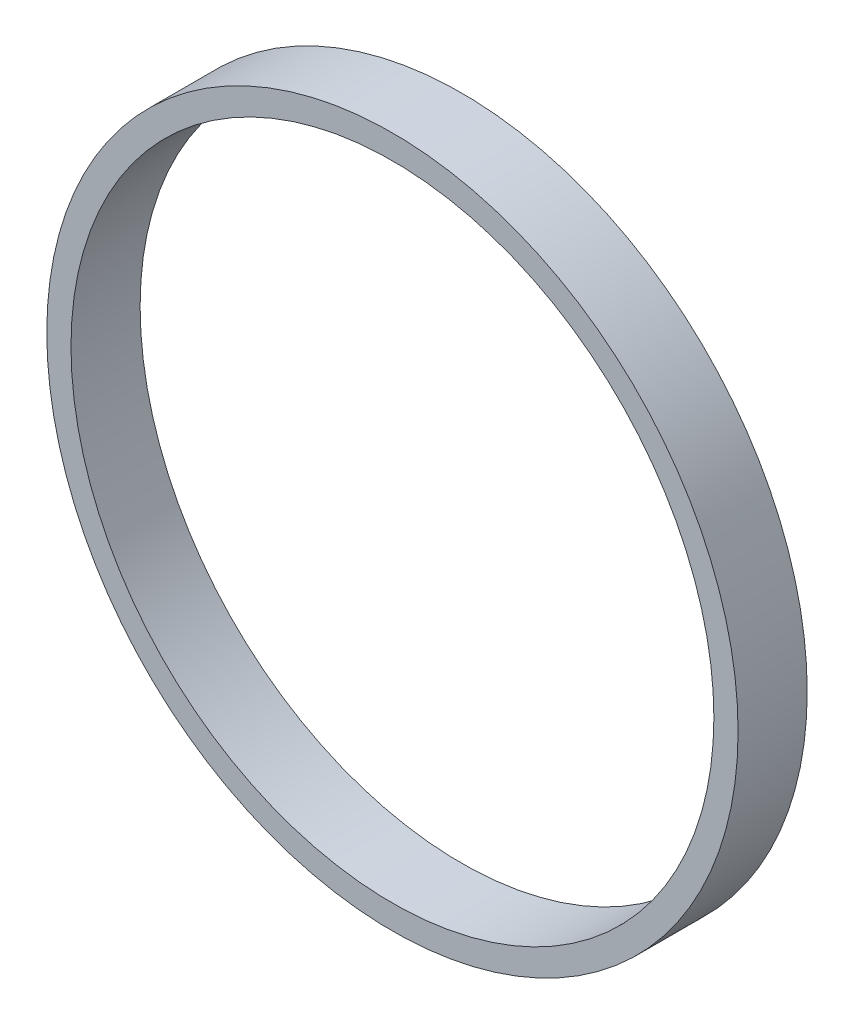
ISO-10303-21;
HEADER;
FILE_DESCRIPTION(('STEP AP214'),'2;1');
FILE_NAME('part.step','',(''),(''),'','','');
FILE_SCHEMA(('AUTOMOTIVE_DESIGN { 1 0 10303 214 1 1 1 1 }'));
ENDSEC;
DATA;
#1=APPLICATION_CONTEXT('core data for automotive mechanical design processes');
#2=APPLICATION_PROTOCOL_DEFINITION('international standard','automotive_design',2000,#1);
#3=PRODUCT_CONTEXT('',#1,'mechanical');
#4=PRODUCT('Part','Part','',(#3));
#5=PRODUCT_RELATED_PRODUCT_CATEGORY('part','',(#4));
#6=PRODUCT_DEFINITION_FORMATION('','',#4);
#7=PRODUCT_DEFINITION_CONTEXT('part definition',#1,'design');
#8=PRODUCT_DEFINITION('design','',#6,#7);
#9=PRODUCT_DEFINITION_SHAPE('','',#8);
#10=(LENGTH_UNIT() NAMED_UNIT(*) SI_UNIT(.MILLI.,.METRE.));
#11=(NAMED_UNIT(*) PLANE_ANGLE_UNIT() SI_UNIT($,.RADIAN.));
#12=(NAMED_UNIT(*) SI_UNIT($,.STERADIAN.) SOLID_ANGLE_UNIT());
#13=UNCERTAINTY_MEASURE_WITH_UNIT(LENGTH_MEASURE(1.E-05),#10,'distance_accuracy_value','');
#14=(GEOMETRIC_REPRESENTATION_CONTEXT(3) GLOBAL_UNCERTAINTY_ASSIGNED_CONTEXT((#13)) GLOBAL_UNIT_ASSIGNED_CONTEXT((#10,
#11,#12)) REPRESENTATION_CONTEXT('',''));
#15=CARTESIAN_POINT('',(0.,0.,0.));
#16=DIRECTION('',(0.,0.,1.));
#17=DIRECTION('',(1.,0.,0.));
#18=AXIS2_PLACEMENT_3D('',#15,#16,#17);
#19=CARTESIAN_POINT('',(0.,0.,4.));
#20=DIRECTION('',(0.,0.,1.));
#21=DIRECTION('',(1.,0.,0.));
#22=AXIS2_PLACEMENT_3D('',#19,#20,#21);
#23=PLANE('',#22);
#24=CARTESIAN_POINT('',(0.,0.,4.));
#25=DIRECTION('',(0.,0.,1.));
#26=DIRECTION('',(1.,0.,0.));
#27=AXIS2_PLACEMENT_3D('',#24,#25,#26);
#28=CIRCLE('',#27,20.);
#29=CARTESIAN_POINT('',(20.,0.,4.));
#30=VERTEX_POINT('',#29);
#31=EDGE_CURVE('E10',#30,#30,#28,.T.);
#32=ORIENTED_EDGE('',*,*,#31,.T.);
#33=EDGE_LOOP('',(#32));
#34=FACE_BOUND('',#33,.T.);
#35=CARTESIAN_POINT('',(0.,0.,4.));
#36=DIRECTION('',(0.,0.,1.));
#37=DIRECTION('',(1.,0.,0.));
#38=AXIS2_PLACEMENT_3D('',#35,#36,#37);
#39=CIRCLE('',#38,18.6);
#40=CARTESIAN_POINT('',(18.6,0.,4.));
#41=VERTEX_POINT('',#40);
#42=EDGE_CURVE('E42',#41,#41,#39,.T.);
#43=ORIENTED_EDGE('',*,*,#42,.F.);
#44=EDGE_LOOP('',(#43));
#45=FACE_BOUND('',#44,.T.);
#46=ADVANCED_FACE('F31',(#34,#45),#23,.T.);
#47=CARTESIAN_POINT('',(0.,0.,0.));
#48=DIRECTION('',(0.,0.,1.));
#49=DIRECTION('',(1.,0.,0.));
#50=AXIS2_PLACEMENT_3D('',#47,#48,#49);
#51=PLANE('',#50);
#52=CARTESIAN_POINT('',(0.,0.,0.));
#53=DIRECTION('',(0.,0.,1.));
#54=DIRECTION('',(1.,0.,0.));
#55=AXIS2_PLACEMENT_3D('',#52,#53,#54);
#56=CIRCLE('',#55,20.);
#57=CARTESIAN_POINT('',(20.,0.,0.));
#58=VERTEX_POINT('',#57);
#59=EDGE_CURVE('E35',#58,#58,#56,.T.);
#60=ORIENTED_EDGE('',*,*,#59,.F.);
#61=EDGE_LOOP('',(#60));
#62=FACE_BOUND('',#61,.T.);
#63=CARTESIAN_POINT('',(0.,0.,0.));
#64=DIRECTION('',(0.,0.,1.));
#65=DIRECTION('',(1.,0.,0.));
#66=AXIS2_PLACEMENT_3D('',#63,#64,#65);
#67=CIRCLE('',#66,18.6);
#68=CARTESIAN_POINT('',(18.6,0.,0.));
#69=VERTEX_POINT('',#68);
#70=EDGE_CURVE('E44',#69,#69,#67,.T.);
#71=ORIENTED_EDGE('',*,*,#70,.T.);
#72=EDGE_LOOP('',(#71));
#73=FACE_BOUND('',#72,.T.);
#74=ADVANCED_FACE('F54',(#62,#73),#51,.F.);
#75=CARTESIAN_POINT('',(0.,0.,4.));
#76=DIRECTION('',(0.,0.,-1.));
#77=DIRECTION('',(-1.,0.,0.));
#78=AXIS2_PLACEMENT_3D('',#75,#76,#77);
#79=CYLINDRICAL_SURFACE('',#78,20.);
#80=ORIENTED_EDGE('',*,*,#31,.F.);
#81=EDGE_LOOP('',(#80));
#82=FACE_BOUND('',#81,.T.);
#83=ORIENTED_EDGE('',*,*,#59,.T.);
#84=EDGE_LOOP('',(#83));
#85=FACE_BOUND('',#84,.T.);
#86=ADVANCED_FACE('F33',(#82,#85),#79,.T.);
#87=CARTESIAN_POINT('',(0.,0.,4.));
#88=DIRECTION('',(0.,0.,-1.));
#89=DIRECTION('',(-1.,0.,0.));
#90=AXIS2_PLACEMENT_3D('',#87,#88,#89);
#91=CYLINDRICAL_SURFACE('',#90,18.6);
#92=ORIENTED_EDGE('',*,*,#42,.T.);
#93=EDGE_LOOP('',(#92));
#94=FACE_BOUND('',#93,.T.);
#95=ORIENTED_EDGE('',*,*,#70,.F.);
#96=EDGE_LOOP('',(#95));
#97=FACE_BOUND('',#96,.T.);
#98=ADVANCED_FACE('F50',(#94,#97),#91,.F.);
#99=CLOSED_SHELL('',(#46,#74,#86,#98));
#100=MANIFOLD_SOLID_BREP('B2',#99);
#101=ADVANCED_BREP_SHAPE_REPRESENTATION('',(#18,#100),#14);
#102=SHAPE_DEFINITION_REPRESENTATION(#9,#101);
ENDSEC;
END-ISO-10303-21;
